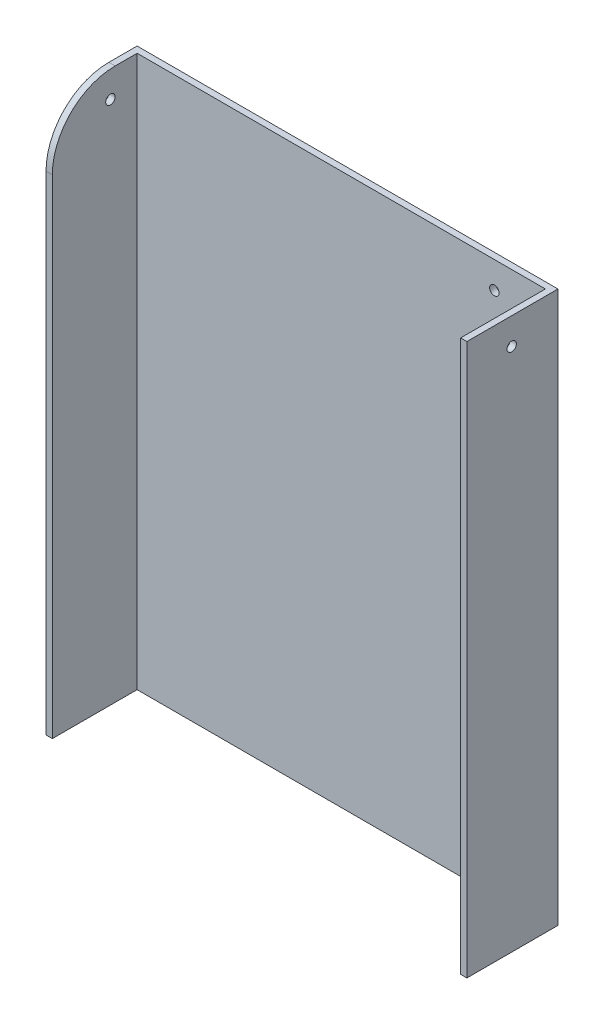
ISO-10303-21;
HEADER;
FILE_DESCRIPTION(('STEP AP214'),'2;1');
FILE_NAME('part.step','',(''),(''),'','','');
FILE_SCHEMA(('AUTOMOTIVE_DESIGN { 1 0 10303 214 1 1 1 1 }'));
ENDSEC;
DATA;
#1=APPLICATION_CONTEXT('core data for automotive mechanical design processes');
#2=APPLICATION_PROTOCOL_DEFINITION('international standard','automotive_design',2000,#1);
#3=PRODUCT_CONTEXT('',#1,'mechanical');
#4=PRODUCT('Part','Part','',(#3));
#5=PRODUCT_RELATED_PRODUCT_CATEGORY('part','',(#4));
#6=PRODUCT_DEFINITION_FORMATION('','',#4);
#7=PRODUCT_DEFINITION_CONTEXT('part definition',#1,'design');
#8=PRODUCT_DEFINITION('design','',#6,#7);
#9=PRODUCT_DEFINITION_SHAPE('','',#8);
#10=(LENGTH_UNIT() NAMED_UNIT(*) SI_UNIT(.MILLI.,.METRE.));
#11=(NAMED_UNIT(*) PLANE_ANGLE_UNIT() SI_UNIT($,.RADIAN.));
#12=(NAMED_UNIT(*) SI_UNIT($,.STERADIAN.) SOLID_ANGLE_UNIT());
#13=UNCERTAINTY_MEASURE_WITH_UNIT(LENGTH_MEASURE(1.E-05),#10,'distance_accuracy_value','');
#14=(GEOMETRIC_REPRESENTATION_CONTEXT(3) GLOBAL_UNCERTAINTY_ASSIGNED_CONTEXT((#13)) GLOBAL_UNIT_ASSIGNED_CONTEXT((#10,
#11,#12)) REPRESENTATION_CONTEXT('',''));
#15=CARTESIAN_POINT('',(0.,0.,0.));
#16=DIRECTION('',(0.,0.,1.));
#17=DIRECTION('',(1.,0.,0.));
#18=AXIS2_PLACEMENT_3D('',#15,#16,#17);
#19=CARTESIAN_POINT('',(0.,0.,2.));
#20=DIRECTION('',(0.,1.,0.));
#21=DIRECTION('',(0.,0.,1.));
#22=AXIS2_PLACEMENT_3D('',#19,#20,#21);
#23=PLANE('',#22);
#24=DIRECTION('',(1.,0.,0.));
#25=VECTOR('',#24,1.);
#26=CARTESIAN_POINT('',(0.,0.,0.));
#27=LINE('',#26,#25);
#28=CARTESIAN_POINT('',(-2.,0.,0.));
#29=VERTEX_POINT('',#28);
#30=CARTESIAN_POINT('',(115.33225701208,0.,0.));
#31=VERTEX_POINT('',#30);
#32=EDGE_CURVE('E161',#29,#31,#27,.T.);
#33=ORIENTED_EDGE('',*,*,#32,.T.);
#34=DIRECTION('',(0.,0.,1.));
#35=VECTOR('',#34,1.);
#36=CARTESIAN_POINT('',(115.33225701208,0.,-2.));
#37=LINE('',#36,#35);
#38=CARTESIAN_POINT('',(115.33225701208,0.,2.));
#39=VERTEX_POINT('',#38);
#40=EDGE_CURVE('E147',#31,#39,#37,.T.);
#41=ORIENTED_EDGE('',*,*,#40,.T.);
#42=DIRECTION('',(1.,0.,0.));
#43=VECTOR('',#42,1.);
#44=CARTESIAN_POINT('',(0.,0.,2.));
#45=LINE('',#44,#43);
#46=CARTESIAN_POINT('',(0.,0.,2.));
#47=VERTEX_POINT('',#46);
#48=EDGE_CURVE('E158',#47,#39,#45,.T.);
#49=ORIENTED_EDGE('',*,*,#48,.F.);
#50=DIRECTION('',(0.,0.,1.));
#51=VECTOR('',#50,1.);
#52=CARTESIAN_POINT('',(0.,0.,0.));
#53=LINE('',#52,#51);
#54=CARTESIAN_POINT('',(0.,0.,29.));
#55=VERTEX_POINT('',#54);
#56=EDGE_CURVE('E224',#47,#55,#53,.T.);
#57=ORIENTED_EDGE('',*,*,#56,.T.);
#58=DIRECTION('',(1.,0.,0.));
#59=VECTOR('',#58,1.);
#60=CARTESIAN_POINT('',(-2.,0.,29.));
#61=LINE('',#60,#59);
#62=CARTESIAN_POINT('',(-2.,0.,29.));
#63=VERTEX_POINT('',#62);
#64=EDGE_CURVE('E237',#63,#55,#61,.T.);
#65=ORIENTED_EDGE('',*,*,#64,.F.);
#66=DIRECTION('',(0.,0.,1.));
#67=VECTOR('',#66,1.);
#68=CARTESIAN_POINT('',(-2.,0.,0.));
#69=LINE('',#68,#67);
#70=EDGE_CURVE('E229',#29,#63,#69,.T.);
#71=ORIENTED_EDGE('',*,*,#70,.F.);
#72=EDGE_LOOP('',(#33,#41,#49,#57,#65,#71));
#73=FACE_BOUND('',#72,.T.);
#74=ADVANCED_FACE('F37',(#73),#23,.F.);
#75=CARTESIAN_POINT('',(125.33225701208,0.,2.));
#76=VERTEX_POINT('',#75);
#77=CARTESIAN_POINT('',(130.,0.,2.));
#78=VERTEX_POINT('',#77);
#79=EDGE_CURVE('E170',#76,#78,#45,.T.);
#80=ORIENTED_EDGE('',*,*,#79,.F.);
#81=DIRECTION('',(0.,0.,1.));
#82=VECTOR('',#81,1.);
#83=CARTESIAN_POINT('',(125.33225701208,0.,-2.));
#84=LINE('',#83,#82);
#85=CARTESIAN_POINT('',(125.33225701208,0.,0.));
#86=VERTEX_POINT('',#85);
#87=EDGE_CURVE('E162',#86,#76,#84,.T.);
#88=ORIENTED_EDGE('',*,*,#87,.F.);
#89=CARTESIAN_POINT('',(132.,0.,0.));
#90=VERTEX_POINT('',#89);
#91=EDGE_CURVE('E182',#86,#90,#27,.T.);
#92=ORIENTED_EDGE('',*,*,#91,.T.);
#93=DIRECTION('',(0.,0.,-1.));
#94=VECTOR('',#93,1.);
#95=CARTESIAN_POINT('',(132.,0.,0.));
#96=LINE('',#95,#94);
#97=CARTESIAN_POINT('',(132.,0.,29.));
#98=VERTEX_POINT('',#97);
#99=EDGE_CURVE('E254',#98,#90,#96,.T.);
#100=ORIENTED_EDGE('',*,*,#99,.F.);
#101=DIRECTION('',(-1.,0.,0.));
#102=VECTOR('',#101,1.);
#103=CARTESIAN_POINT('',(132.,0.,29.));
#104=LINE('',#103,#102);
#105=CARTESIAN_POINT('',(130.,0.,29.));
#106=VERTEX_POINT('',#105);
#107=EDGE_CURVE('E257',#98,#106,#104,.T.);
#108=ORIENTED_EDGE('',*,*,#107,.T.);
#109=DIRECTION('',(0.,0.,-1.));
#110=VECTOR('',#109,1.);
#111=CARTESIAN_POINT('',(130.,0.,0.));
#112=LINE('',#111,#110);
#113=EDGE_CURVE('E250',#106,#78,#112,.T.);
#114=ORIENTED_EDGE('',*,*,#113,.T.);
#115=EDGE_LOOP('',(#80,#88,#92,#100,#108,#114));
#116=FACE_BOUND('',#115,.T.);
#117=ADVANCED_FACE('F275',(#116),#23,.F.);
#118=CARTESIAN_POINT('',(0.,175.5,2.));
#119=DIRECTION('',(0.,-1.,0.));
#120=DIRECTION('',(0.,0.,-1.));
#121=AXIS2_PLACEMENT_3D('',#118,#119,#120);
#122=PLANE('',#121);
#123=DIRECTION('',(0.,0.,-1.));
#124=VECTOR('',#123,1.);
#125=CARTESIAN_POINT('',(-2.,175.5,0.));
#126=LINE('',#125,#124);
#127=CARTESIAN_POINT('',(-2.,175.5,8.99999999999998));
#128=VERTEX_POINT('',#127);
#129=CARTESIAN_POINT('',(-2.,175.5,0.));
#130=VERTEX_POINT('',#129);
#131=EDGE_CURVE('E235',#128,#130,#126,.T.);
#132=ORIENTED_EDGE('',*,*,#131,.F.);
#133=DIRECTION('',(1.,0.,0.));
#134=VECTOR('',#133,1.);
#135=CARTESIAN_POINT('',(0.,175.5,8.99999999999998));
#136=LINE('',#135,#134);
#137=CARTESIAN_POINT('',(0.,175.5,8.99999999999998));
#138=VERTEX_POINT('',#137);
#139=EDGE_CURVE('E191',#128,#138,#136,.T.);
#140=ORIENTED_EDGE('',*,*,#139,.T.);
#141=DIRECTION('',(0.,0.,-1.));
#142=VECTOR('',#141,1.);
#143=CARTESIAN_POINT('',(0.,175.5,0.));
#144=LINE('',#143,#142);
#145=CARTESIAN_POINT('',(0.,175.5,2.));
#146=VERTEX_POINT('',#145);
#147=EDGE_CURVE('E230',#138,#146,#144,.T.);
#148=ORIENTED_EDGE('',*,*,#147,.T.);
#149=DIRECTION('',(-1.,0.,0.));
#150=VECTOR('',#149,1.);
#151=CARTESIAN_POINT('',(0.,175.5,2.));
#152=LINE('',#151,#150);
#153=CARTESIAN_POINT('',(130.,175.5,2.));
#154=VERTEX_POINT('',#153);
#155=EDGE_CURVE('E173',#154,#146,#152,.T.);
#156=ORIENTED_EDGE('',*,*,#155,.F.);
#157=DIRECTION('',(0.,0.,1.));
#158=VECTOR('',#157,1.);
#159=CARTESIAN_POINT('',(130.,175.5,0.));
#160=LINE('',#159,#158);
#161=CARTESIAN_POINT('',(130.,175.5,29.));
#162=VERTEX_POINT('',#161);
#163=EDGE_CURVE('E245',#154,#162,#160,.T.);
#164=ORIENTED_EDGE('',*,*,#163,.T.);
#165=DIRECTION('',(-1.,0.,0.));
#166=VECTOR('',#165,1.);
#167=CARTESIAN_POINT('',(132.,175.5,29.));
#168=LINE('',#167,#166);
#169=CARTESIAN_POINT('',(132.,175.5,29.));
#170=VERTEX_POINT('',#169);
#171=EDGE_CURVE('E264',#170,#162,#168,.T.);
#172=ORIENTED_EDGE('',*,*,#171,.F.);
#173=DIRECTION('',(0.,0.,1.));
#174=VECTOR('',#173,1.);
#175=CARTESIAN_POINT('',(132.,175.5,0.));
#176=LINE('',#175,#174);
#177=CARTESIAN_POINT('',(132.,175.5,0.));
#178=VERTEX_POINT('',#177);
#179=EDGE_CURVE('E249',#178,#170,#176,.T.);
#180=ORIENTED_EDGE('',*,*,#179,.F.);
#181=DIRECTION('',(-1.,0.,0.));
#182=VECTOR('',#181,1.);
#183=CARTESIAN_POINT('',(0.,175.5,0.));
#184=LINE('',#183,#182);
#185=EDGE_CURVE('E181',#178,#130,#184,.T.);
#186=ORIENTED_EDGE('',*,*,#185,.T.);
#187=EDGE_LOOP('',(#132,#140,#148,#156,#164,#172,#180,#186));
#188=FACE_BOUND('',#187,.T.);
#189=ADVANCED_FACE('F284',(#188),#122,.F.);
#190=CARTESIAN_POINT('',(0.,0.,2.));
#191=DIRECTION('',(0.,0.,-1.));
#192=DIRECTION('',(-1.,0.,0.));
#193=AXIS2_PLACEMENT_3D('',#190,#191,#192);
#194=PLANE('',#193);
#195=CARTESIAN_POINT('',(113.75,167.,2.));
#196=DIRECTION('',(0.,0.,1.));
#197=DIRECTION('',(1.,0.,0.));
#198=AXIS2_PLACEMENT_3D('',#195,#196,#197);
#199=CIRCLE('',#198,1.5);
#200=CARTESIAN_POINT('',(115.25,167.,2.));
#201=VERTEX_POINT('',#200);
#202=EDGE_CURVE('E369',#201,#201,#199,.T.);
#203=ORIENTED_EDGE('',*,*,#202,.F.);
#204=EDGE_LOOP('',(#203));
#205=FACE_BOUND('',#204,.T.);
#206=ORIENTED_EDGE('',*,*,#48,.T.);
#207=DIRECTION('',(0.,-1.,0.));
#208=VECTOR('',#207,1.);
#209=CARTESIAN_POINT('',(115.33225701208,5.,2.));
#210=LINE('',#209,#208);
#211=CARTESIAN_POINT('',(115.33225701208,4.,2.));
#212=VERTEX_POINT('',#211);
#213=EDGE_CURVE('E143',#212,#39,#210,.T.);
#214=ORIENTED_EDGE('',*,*,#213,.F.);
#215=CARTESIAN_POINT('',(116.33225701208,4.,2.));
#216=DIRECTION('',(0.,0.,-1.));
#217=DIRECTION('',(-1.,0.,0.));
#218=AXIS2_PLACEMENT_3D('',#215,#216,#217);
#219=CIRCLE('',#218,1.);
#220=CARTESIAN_POINT('',(116.33225701208,5.,2.));
#221=VERTEX_POINT('',#220);
#222=EDGE_CURVE('E207',#212,#221,#219,.T.);
#223=ORIENTED_EDGE('',*,*,#222,.T.);
#224=DIRECTION('',(-1.,0.,0.));
#225=VECTOR('',#224,1.);
#226=CARTESIAN_POINT('',(115.33225701208,5.,2.));
#227=LINE('',#226,#225);
#228=CARTESIAN_POINT('',(124.33225701208,5.,2.));
#229=VERTEX_POINT('',#228);
#230=EDGE_CURVE('E163',#229,#221,#227,.T.);
#231=ORIENTED_EDGE('',*,*,#230,.F.);
#232=CARTESIAN_POINT('',(124.33225701208,4.,2.));
#233=DIRECTION('',(0.,0.,-1.));
#234=DIRECTION('',(-1.,0.,0.));
#235=AXIS2_PLACEMENT_3D('',#232,#233,#234);
#236=CIRCLE('',#235,1.);
#237=CARTESIAN_POINT('',(125.33225701208,4.,2.));
#238=VERTEX_POINT('',#237);
#239=EDGE_CURVE('E45',#229,#238,#236,.T.);
#240=ORIENTED_EDGE('',*,*,#239,.T.);
#241=DIRECTION('',(0.,1.,0.));
#242=VECTOR('',#241,1.);
#243=CARTESIAN_POINT('',(125.33225701208,5.,2.));
#244=LINE('',#243,#242);
#245=EDGE_CURVE('E152',#76,#238,#244,.T.);
#246=ORIENTED_EDGE('',*,*,#245,.F.);
#247=ORIENTED_EDGE('',*,*,#79,.T.);
#248=DIRECTION('',(0.,1.,0.));
#249=VECTOR('',#248,1.);
#250=CARTESIAN_POINT('',(130.,0.,2.));
#251=LINE('',#250,#249);
#252=EDGE_CURVE('E169',#78,#154,#251,.T.);
#253=ORIENTED_EDGE('',*,*,#252,.T.);
#254=ORIENTED_EDGE('',*,*,#155,.T.);
#255=DIRECTION('',(0.,-1.,0.));
#256=VECTOR('',#255,1.);
#257=CARTESIAN_POINT('',(0.,0.,2.));
#258=LINE('',#257,#256);
#259=EDGE_CURVE('E168',#146,#47,#258,.T.);
#260=ORIENTED_EDGE('',*,*,#259,.T.);
#261=EDGE_LOOP('',(#206,#214,#223,#231,#240,#246,#247,#253,#254,#260));
#262=FACE_BOUND('',#261,.T.);
#263=ADVANCED_FACE('F165',(#205,#262),#194,.F.);
#264=CARTESIAN_POINT('',(0.,0.,0.));
#265=DIRECTION('',(0.,0.,-1.));
#266=DIRECTION('',(-1.,0.,0.));
#267=AXIS2_PLACEMENT_3D('',#264,#265,#266);
#268=PLANE('',#267);
#269=CARTESIAN_POINT('',(113.75,167.,0.));
#270=DIRECTION('',(0.,0.,1.));
#271=DIRECTION('',(1.,0.,0.));
#272=AXIS2_PLACEMENT_3D('',#269,#270,#271);
#273=CIRCLE('',#272,1.5);
#274=CARTESIAN_POINT('',(115.25,167.,0.));
#275=VERTEX_POINT('',#274);
#276=EDGE_CURVE('E372',#275,#275,#273,.T.);
#277=ORIENTED_EDGE('',*,*,#276,.T.);
#278=EDGE_LOOP('',(#277));
#279=FACE_BOUND('',#278,.T.);
#280=DIRECTION('',(0.,1.,0.));
#281=VECTOR('',#280,1.);
#282=CARTESIAN_POINT('',(115.33225701208,0.,0.));
#283=LINE('',#282,#281);
#284=CARTESIAN_POINT('',(115.33225701208,4.,0.));
#285=VERTEX_POINT('',#284);
#286=EDGE_CURVE('E189',#31,#285,#283,.T.);
#287=ORIENTED_EDGE('',*,*,#286,.F.);
#288=ORIENTED_EDGE('',*,*,#32,.F.);
#289=DIRECTION('',(0.,-1.,0.));
#290=VECTOR('',#289,1.);
#291=CARTESIAN_POINT('',(-2.,175.5,0.));
#292=LINE('',#291,#290);
#293=EDGE_CURVE('E226',#130,#29,#292,.T.);
#294=ORIENTED_EDGE('',*,*,#293,.F.);
#295=ORIENTED_EDGE('',*,*,#185,.F.);
#296=DIRECTION('',(0.,1.,0.));
#297=VECTOR('',#296,1.);
#298=CARTESIAN_POINT('',(132.,175.5,0.));
#299=LINE('',#298,#297);
#300=EDGE_CURVE('E246',#90,#178,#299,.T.);
#301=ORIENTED_EDGE('',*,*,#300,.F.);
#302=ORIENTED_EDGE('',*,*,#91,.F.);
#303=DIRECTION('',(0.,-1.,0.));
#304=VECTOR('',#303,1.);
#305=CARTESIAN_POINT('',(125.33225701208,0.,0.));
#306=LINE('',#305,#304);
#307=CARTESIAN_POINT('',(125.33225701208,4.,0.));
#308=VERTEX_POINT('',#307);
#309=EDGE_CURVE('E179',#308,#86,#306,.T.);
#310=ORIENTED_EDGE('',*,*,#309,.F.);
#311=CARTESIAN_POINT('',(124.33225701208,4.,0.));
#312=DIRECTION('',(0.,0.,-1.));
#313=DIRECTION('',(-1.,0.,0.));
#314=AXIS2_PLACEMENT_3D('',#311,#312,#313);
#315=CIRCLE('',#314,1.);
#316=CARTESIAN_POINT('',(124.33225701208,5.,0.));
#317=VERTEX_POINT('',#316);
#318=EDGE_CURVE('E11',#308,#317,#315,.F.);
#319=ORIENTED_EDGE('',*,*,#318,.T.);
#320=DIRECTION('',(1.,0.,0.));
#321=VECTOR('',#320,1.);
#322=CARTESIAN_POINT('',(0.,5.,0.));
#323=LINE('',#322,#321);
#324=CARTESIAN_POINT('',(116.33225701208,5.,0.));
#325=VERTEX_POINT('',#324);
#326=EDGE_CURVE('E186',#325,#317,#323,.T.);
#327=ORIENTED_EDGE('',*,*,#326,.F.);
#328=CARTESIAN_POINT('',(116.33225701208,4.,0.));
#329=DIRECTION('',(0.,0.,-1.));
#330=DIRECTION('',(-1.,0.,0.));
#331=AXIS2_PLACEMENT_3D('',#328,#329,#330);
#332=CIRCLE('',#331,1.);
#333=EDGE_CURVE('E209',#325,#285,#332,.F.);
#334=ORIENTED_EDGE('',*,*,#333,.T.);
#335=EDGE_LOOP('',(#287,#288,#294,#295,#301,#302,#310,#319,#327,#334));
#336=FACE_BOUND('',#335,.T.);
#337=ADVANCED_FACE('F213',(#279,#336),#268,.T.);
#338=CARTESIAN_POINT('',(130.,0.,0.));
#339=DIRECTION('',(-1.,0.,0.));
#340=DIRECTION('',(0.,0.,1.));
#341=AXIS2_PLACEMENT_3D('',#338,#339,#340);
#342=PLANE('',#341);
#343=CARTESIAN_POINT('',(130.,167.,14.73));
#344=DIRECTION('',(-1.,0.,0.));
#345=DIRECTION('',(0.,0.,1.));
#346=AXIS2_PLACEMENT_3D('',#343,#344,#345);
#347=CIRCLE('',#346,1.5);
#348=CARTESIAN_POINT('',(130.,167.,16.23));
#349=VERTEX_POINT('',#348);
#350=EDGE_CURVE('E375',#349,#349,#347,.T.);
#351=ORIENTED_EDGE('',*,*,#350,.F.);
#352=EDGE_LOOP('',(#351));
#353=FACE_BOUND('',#352,.T.);
#354=ORIENTED_EDGE('',*,*,#252,.F.);
#355=ORIENTED_EDGE('',*,*,#113,.F.);
#356=DIRECTION('',(0.,-1.,0.));
#357=VECTOR('',#356,1.);
#358=CARTESIAN_POINT('',(130.,175.5,29.));
#359=LINE('',#358,#357);
#360=EDGE_CURVE('E259',#162,#106,#359,.T.);
#361=ORIENTED_EDGE('',*,*,#360,.F.);
#362=ORIENTED_EDGE('',*,*,#163,.F.);
#363=EDGE_LOOP('',(#354,#355,#361,#362));
#364=FACE_BOUND('',#363,.T.);
#365=ADVANCED_FACE('F290',(#353,#364),#342,.T.);
#366=CARTESIAN_POINT('',(132.,175.5,29.));
#367=DIRECTION('',(0.,0.,-1.));
#368=DIRECTION('',(0.,1.,0.));
#369=AXIS2_PLACEMENT_3D('',#366,#367,#368);
#370=PLANE('',#369);
#371=ORIENTED_EDGE('',*,*,#360,.T.);
#372=ORIENTED_EDGE('',*,*,#107,.F.);
#373=DIRECTION('',(0.,-1.,0.));
#374=VECTOR('',#373,1.);
#375=CARTESIAN_POINT('',(132.,175.5,29.));
#376=LINE('',#375,#374);
#377=EDGE_CURVE('E252',#170,#98,#376,.T.);
#378=ORIENTED_EDGE('',*,*,#377,.F.);
#379=ORIENTED_EDGE('',*,*,#171,.T.);
#380=EDGE_LOOP('',(#371,#372,#378,#379));
#381=FACE_BOUND('',#380,.T.);
#382=ADVANCED_FACE('F286',(#381),#370,.F.);
#383=CARTESIAN_POINT('',(132.,0.,0.));
#384=DIRECTION('',(-1.,0.,0.));
#385=DIRECTION('',(0.,0.,1.));
#386=AXIS2_PLACEMENT_3D('',#383,#384,#385);
#387=PLANE('',#386);
#388=CARTESIAN_POINT('',(132.,167.,14.73));
#389=DIRECTION('',(-1.,0.,0.));
#390=DIRECTION('',(0.,0.,1.));
#391=AXIS2_PLACEMENT_3D('',#388,#389,#390);
#392=CIRCLE('',#391,1.5);
#393=CARTESIAN_POINT('',(132.,167.,16.23));
#394=VERTEX_POINT('',#393);
#395=EDGE_CURVE('E153',#394,#394,#392,.T.);
#396=ORIENTED_EDGE('',*,*,#395,.T.);
#397=EDGE_LOOP('',(#396));
#398=FACE_BOUND('',#397,.T.);
#399=ORIENTED_EDGE('',*,*,#300,.T.);
#400=ORIENTED_EDGE('',*,*,#179,.T.);
#401=ORIENTED_EDGE('',*,*,#377,.T.);
#402=ORIENTED_EDGE('',*,*,#99,.T.);
#403=EDGE_LOOP('',(#399,#400,#401,#402));
#404=FACE_BOUND('',#403,.T.);
#405=ADVANCED_FACE('F278',(#398,#404),#387,.F.);
#406=CARTESIAN_POINT('',(-2.,175.5,29.));
#407=DIRECTION('',(0.,0.,-1.));
#408=DIRECTION('',(0.,1.,0.));
#409=AXIS2_PLACEMENT_3D('',#406,#407,#408);
#410=PLANE('',#409);
#411=DIRECTION('',(0.,1.,0.));
#412=VECTOR('',#411,1.);
#413=CARTESIAN_POINT('',(0.,175.5,29.));
#414=LINE('',#413,#412);
#415=CARTESIAN_POINT('',(0.,155.5,29.));
#416=VERTEX_POINT('',#415);
#417=EDGE_CURVE('E239',#55,#416,#414,.T.);
#418=ORIENTED_EDGE('',*,*,#417,.T.);
#419=DIRECTION('',(1.,0.,0.));
#420=VECTOR('',#419,1.);
#421=CARTESIAN_POINT('',(-2.,155.5,29.));
#422=LINE('',#421,#420);
#423=CARTESIAN_POINT('',(-2.,155.5,29.));
#424=VERTEX_POINT('',#423);
#425=EDGE_CURVE('E196',#416,#424,#422,.F.);
#426=ORIENTED_EDGE('',*,*,#425,.T.);
#427=DIRECTION('',(0.,1.,0.));
#428=VECTOR('',#427,1.);
#429=CARTESIAN_POINT('',(-2.,175.5,29.));
#430=LINE('',#429,#428);
#431=EDGE_CURVE('E232',#63,#424,#430,.T.);
#432=ORIENTED_EDGE('',*,*,#431,.F.);
#433=ORIENTED_EDGE('',*,*,#64,.T.);
#434=EDGE_LOOP('',(#418,#426,#432,#433));
#435=FACE_BOUND('',#434,.T.);
#436=ADVANCED_FACE('F299',(#435),#410,.F.);
#437=CARTESIAN_POINT('',(-2.,0.,0.));
#438=DIRECTION('',(-1.,0.,0.));
#439=DIRECTION('',(0.,0.,1.));
#440=AXIS2_PLACEMENT_3D('',#437,#438,#439);
#441=PLANE('',#440);
#442=CARTESIAN_POINT('',(-2.,167.,10.5));
#443=DIRECTION('',(1.,0.,0.));
#444=DIRECTION('',(0.,0.,-1.));
#445=AXIS2_PLACEMENT_3D('',#442,#443,#444);
#446=CIRCLE('',#445,1.5);
#447=CARTESIAN_POINT('',(-2.,167.,9.));
#448=VERTEX_POINT('',#447);
#449=EDGE_CURVE('E364',#448,#448,#446,.T.);
#450=ORIENTED_EDGE('',*,*,#449,.T.);
#451=EDGE_LOOP('',(#450));
#452=FACE_BOUND('',#451,.T.);
#453=ORIENTED_EDGE('',*,*,#431,.T.);
#454=CARTESIAN_POINT('',(-2.,155.5,8.99999999999998));
#455=DIRECTION('',(-1.,0.,0.));
#456=DIRECTION('',(0.,0.,1.));
#457=AXIS2_PLACEMENT_3D('',#454,#455,#456);
#458=CIRCLE('',#457,20.);
#459=EDGE_CURVE('E198',#424,#128,#458,.T.);
#460=ORIENTED_EDGE('',*,*,#459,.T.);
#461=ORIENTED_EDGE('',*,*,#131,.T.);
#462=ORIENTED_EDGE('',*,*,#293,.T.);
#463=ORIENTED_EDGE('',*,*,#70,.T.);
#464=EDGE_LOOP('',(#453,#460,#461,#462,#463));
#465=FACE_BOUND('',#464,.T.);
#466=ADVANCED_FACE('F303',(#452,#465),#441,.T.);
#467=CARTESIAN_POINT('',(0.,0.,0.));
#468=DIRECTION('',(-1.,0.,0.));
#469=DIRECTION('',(0.,0.,1.));
#470=AXIS2_PLACEMENT_3D('',#467,#468,#469);
#471=PLANE('',#470);
#472=CARTESIAN_POINT('',(0.,167.,10.5));
#473=DIRECTION('',(1.,0.,0.));
#474=DIRECTION('',(0.,0.,-1.));
#475=AXIS2_PLACEMENT_3D('',#472,#473,#474);
#476=CIRCLE('',#475,1.5);
#477=CARTESIAN_POINT('',(0.,167.,9.));
#478=VERTEX_POINT('',#477);
#479=EDGE_CURVE('E367',#478,#478,#476,.T.);
#480=ORIENTED_EDGE('',*,*,#479,.F.);
#481=EDGE_LOOP('',(#480));
#482=FACE_BOUND('',#481,.T.);
#483=ORIENTED_EDGE('',*,*,#147,.F.);
#484=CARTESIAN_POINT('',(0.,155.5,8.99999999999998));
#485=DIRECTION('',(-1.,0.,0.));
#486=DIRECTION('',(0.,0.,1.));
#487=AXIS2_PLACEMENT_3D('',#484,#485,#486);
#488=CIRCLE('',#487,20.);
#489=EDGE_CURVE('E194',#138,#416,#488,.F.);
#490=ORIENTED_EDGE('',*,*,#489,.T.);
#491=ORIENTED_EDGE('',*,*,#417,.F.);
#492=ORIENTED_EDGE('',*,*,#56,.F.);
#493=ORIENTED_EDGE('',*,*,#259,.F.);
#494=EDGE_LOOP('',(#483,#490,#491,#492,#493));
#495=FACE_BOUND('',#494,.T.);
#496=ADVANCED_FACE('F294',(#482,#495),#471,.F.);
#497=CARTESIAN_POINT('',(115.33225701208,5.,-2.));
#498=DIRECTION('',(-1.,0.,0.));
#499=DIRECTION('',(0.,0.,1.));
#500=AXIS2_PLACEMENT_3D('',#497,#498,#499);
#501=PLANE('',#500);
#502=ORIENTED_EDGE('',*,*,#286,.T.);
#503=DIRECTION('',(0.,0.,1.));
#504=VECTOR('',#503,1.);
#505=CARTESIAN_POINT('',(115.33225701208,4.,2.));
#506=LINE('',#505,#504);
#507=EDGE_CURVE('E150',#285,#212,#506,.T.);
#508=ORIENTED_EDGE('',*,*,#507,.T.);
#509=ORIENTED_EDGE('',*,*,#213,.T.);
#510=ORIENTED_EDGE('',*,*,#40,.F.);
#511=EDGE_LOOP('',(#502,#508,#509,#510));
#512=FACE_BOUND('',#511,.T.);
#513=ADVANCED_FACE('F146',(#512),#501,.F.);
#514=CARTESIAN_POINT('',(115.33225701208,5.,-2.));
#515=DIRECTION('',(0.,1.,0.));
#516=DIRECTION('',(0.,0.,1.));
#517=AXIS2_PLACEMENT_3D('',#514,#515,#516);
#518=PLANE('',#517);
#519=ORIENTED_EDGE('',*,*,#230,.T.);
#520=DIRECTION('',(0.,0.,1.));
#521=VECTOR('',#520,1.);
#522=CARTESIAN_POINT('',(116.33225701208,5.,0.));
#523=LINE('',#522,#521);
#524=EDGE_CURVE('E204',#221,#325,#523,.F.);
#525=ORIENTED_EDGE('',*,*,#524,.T.);
#526=ORIENTED_EDGE('',*,*,#326,.T.);
#527=DIRECTION('',(0.,0.,1.));
#528=VECTOR('',#527,1.);
#529=CARTESIAN_POINT('',(124.33225701208,5.,2.));
#530=LINE('',#529,#528);
#531=EDGE_CURVE('E201',#317,#229,#530,.T.);
#532=ORIENTED_EDGE('',*,*,#531,.T.);
#533=EDGE_LOOP('',(#519,#525,#526,#532));
#534=FACE_BOUND('',#533,.T.);
#535=ADVANCED_FACE('F219',(#534),#518,.F.);
#536=CARTESIAN_POINT('',(125.33225701208,5.,-2.));
#537=DIRECTION('',(1.,0.,0.));
#538=DIRECTION('',(0.,0.,-1.));
#539=AXIS2_PLACEMENT_3D('',#536,#537,#538);
#540=PLANE('',#539);
#541=ORIENTED_EDGE('',*,*,#245,.T.);
#542=DIRECTION('',(0.,0.,1.));
#543=VECTOR('',#542,1.);
#544=CARTESIAN_POINT('',(125.33225701208,4.,0.));
#545=LINE('',#544,#543);
#546=EDGE_CURVE('E58',#238,#308,#545,.F.);
#547=ORIENTED_EDGE('',*,*,#546,.T.);
#548=ORIENTED_EDGE('',*,*,#309,.T.);
#549=ORIENTED_EDGE('',*,*,#87,.T.);
#550=EDGE_LOOP('',(#541,#547,#548,#549));
#551=FACE_BOUND('',#550,.T.);
#552=ADVANCED_FACE('F307',(#551),#540,.F.);
#553=CARTESIAN_POINT('',(0.,155.5,8.99999999999998));
#554=DIRECTION('',(1.,0.,0.));
#555=DIRECTION('',(0.,0.,-1.));
#556=AXIS2_PLACEMENT_3D('',#553,#554,#555);
#557=CYLINDRICAL_SURFACE('',#556,20.);
#558=ORIENTED_EDGE('',*,*,#459,.F.);
#559=ORIENTED_EDGE('',*,*,#425,.F.);
#560=ORIENTED_EDGE('',*,*,#489,.F.);
#561=ORIENTED_EDGE('',*,*,#139,.F.);
#562=EDGE_LOOP('',(#558,#559,#560,#561));
#563=FACE_BOUND('',#562,.T.);
#564=ADVANCED_FACE('F305',(#563),#557,.T.);
#565=CARTESIAN_POINT('',(116.33225701208,4.,-2.));
#566=DIRECTION('',(0.,0.,-1.));
#567=DIRECTION('',(-1.,0.,0.));
#568=AXIS2_PLACEMENT_3D('',#565,#566,#567);
#569=CYLINDRICAL_SURFACE('',#568,1.);
#570=ORIENTED_EDGE('',*,*,#333,.F.);
#571=ORIENTED_EDGE('',*,*,#524,.F.);
#572=ORIENTED_EDGE('',*,*,#222,.F.);
#573=ORIENTED_EDGE('',*,*,#507,.F.);
#574=EDGE_LOOP('',(#570,#571,#572,#573));
#575=FACE_BOUND('',#574,.T.);
#576=ADVANCED_FACE('F216',(#575),#569,.F.);
#577=CARTESIAN_POINT('',(124.33225701208,4.,-2.));
#578=DIRECTION('',(0.,0.,-1.));
#579=DIRECTION('',(-1.,0.,0.));
#580=AXIS2_PLACEMENT_3D('',#577,#578,#579);
#581=CYLINDRICAL_SURFACE('',#580,1.);
#582=ORIENTED_EDGE('',*,*,#318,.F.);
#583=ORIENTED_EDGE('',*,*,#546,.F.);
#584=ORIENTED_EDGE('',*,*,#239,.F.);
#585=ORIENTED_EDGE('',*,*,#531,.F.);
#586=EDGE_LOOP('',(#582,#583,#584,#585));
#587=FACE_BOUND('',#586,.T.);
#588=ADVANCED_FACE('F39',(#587),#581,.F.);
#589=CARTESIAN_POINT('',(132.,167.,14.73));
#590=DIRECTION('',(-1.,0.,0.));
#591=DIRECTION('',(0.,0.,1.));
#592=AXIS2_PLACEMENT_3D('',#589,#590,#591);
#593=CYLINDRICAL_SURFACE('',#592,1.5);
#594=ORIENTED_EDGE('',*,*,#395,.F.);
#595=EDGE_LOOP('',(#594));
#596=FACE_BOUND('',#595,.T.);
#597=ORIENTED_EDGE('',*,*,#350,.T.);
#598=EDGE_LOOP('',(#597));
#599=FACE_BOUND('',#598,.T.);
#600=ADVANCED_FACE('F348',(#596,#599),#593,.F.);
#601=CARTESIAN_POINT('',(113.75,167.,0.));
#602=DIRECTION('',(0.,0.,1.));
#603=DIRECTION('',(1.,0.,0.));
#604=AXIS2_PLACEMENT_3D('',#601,#602,#603);
#605=CYLINDRICAL_SURFACE('',#604,1.5);
#606=ORIENTED_EDGE('',*,*,#276,.F.);
#607=EDGE_LOOP('',(#606));
#608=FACE_BOUND('',#607,.T.);
#609=ORIENTED_EDGE('',*,*,#202,.T.);
#610=EDGE_LOOP('',(#609));
#611=FACE_BOUND('',#610,.T.);
#612=ADVANCED_FACE('F351',(#608,#611),#605,.F.);
#613=CARTESIAN_POINT('',(-2.,167.,10.5));
#614=DIRECTION('',(1.,0.,0.));
#615=DIRECTION('',(0.,0.,-1.));
#616=AXIS2_PLACEMENT_3D('',#613,#614,#615);
#617=CYLINDRICAL_SURFACE('',#616,1.5);
#618=ORIENTED_EDGE('',*,*,#449,.F.);
#619=EDGE_LOOP('',(#618));
#620=FACE_BOUND('',#619,.T.);
#621=ORIENTED_EDGE('',*,*,#479,.T.);
#622=EDGE_LOOP('',(#621));
#623=FACE_BOUND('',#622,.T.);
#624=ADVANCED_FACE('F355',(#620,#623),#617,.F.);
#625=CLOSED_SHELL('',(#74,#117,#189,#263,#337,#365,#382,#405,#436,#466,#496,#513,#535,#552,#564,
#576,#588,#600,#612,#624));
#626=MANIFOLD_SOLID_BREP('B2',#625);
#627=ADVANCED_BREP_SHAPE_REPRESENTATION('',(#18,#626),#14);
#628=SHAPE_DEFINITION_REPRESENTATION(#9,#627);
ENDSEC;
END-ISO-10303-21;
